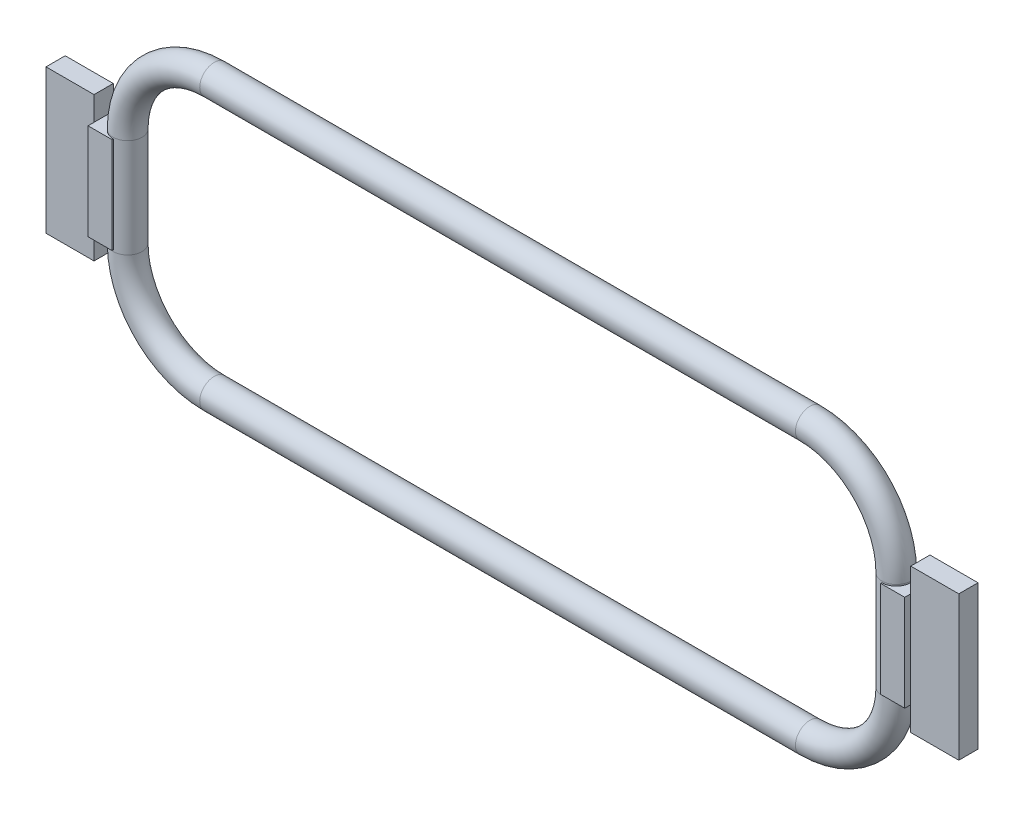
ISO-10303-21;
HEADER;
FILE_DESCRIPTION(('STEP AP214'),'2;1');
FILE_NAME('part.step','',(''),(''),'','','');
FILE_SCHEMA(('AUTOMOTIVE_DESIGN { 1 0 10303 214 1 1 1 1 }'));
ENDSEC;
DATA;
#1=APPLICATION_CONTEXT('core data for automotive mechanical design processes');
#2=APPLICATION_PROTOCOL_DEFINITION('international standard','automotive_design',2000,#1);
#3=PRODUCT_CONTEXT('',#1,'mechanical');
#4=PRODUCT('Part','Part','',(#3));
#5=PRODUCT_RELATED_PRODUCT_CATEGORY('part','',(#4));
#6=PRODUCT_DEFINITION_FORMATION('','',#4);
#7=PRODUCT_DEFINITION_CONTEXT('part definition',#1,'design');
#8=PRODUCT_DEFINITION('design','',#6,#7);
#9=PRODUCT_DEFINITION_SHAPE('','',#8);
#10=(LENGTH_UNIT() NAMED_UNIT(*) SI_UNIT(.MILLI.,.METRE.));
#11=(NAMED_UNIT(*) PLANE_ANGLE_UNIT() SI_UNIT($,.RADIAN.));
#12=(NAMED_UNIT(*) SI_UNIT($,.STERADIAN.) SOLID_ANGLE_UNIT());
#13=UNCERTAINTY_MEASURE_WITH_UNIT(LENGTH_MEASURE(1.E-05),#10,'distance_accuracy_value','');
#14=(GEOMETRIC_REPRESENTATION_CONTEXT(3) GLOBAL_UNCERTAINTY_ASSIGNED_CONTEXT((#13)) GLOBAL_UNIT_ASSIGNED_CONTEXT((#10,
#11,#12)) REPRESENTATION_CONTEXT('',''));
#15=CARTESIAN_POINT('',(0.,0.,0.));
#16=DIRECTION('',(0.,0.,1.));
#17=DIRECTION('',(1.,0.,0.));
#18=AXIS2_PLACEMENT_3D('',#15,#16,#17);
#19=CARTESIAN_POINT('',(0.,75.,-6.25));
#20=DIRECTION('',(-1.,0.,0.));
#21=DIRECTION('',(0.,-1.,0.));
#22=AXIS2_PLACEMENT_3D('',#19,#20,#21);
#23=PLANE('',#22);
#24=DIRECTION('',(0.,0.,1.));
#25=VECTOR('',#24,1.);
#26=CARTESIAN_POINT('',(0.,-50.,20.));
#27=LINE('',#26,#25);
#28=CARTESIAN_POINT('',(0.,-50.,-6.25));
#29=VERTEX_POINT('',#28);
#30=CARTESIAN_POINT('',(0.,-50.,0.));
#31=VERTEX_POINT('',#30);
#32=EDGE_CURVE('E244',#29,#31,#27,.T.);
#33=ORIENTED_EDGE('',*,*,#32,.F.);
#34=DIRECTION('',(0.,-1.,0.));
#35=VECTOR('',#34,1.);
#36=CARTESIAN_POINT('',(0.,75.,-6.25));
#37=LINE('',#36,#35);
#38=CARTESIAN_POINT('',(0.,50.,-6.25));
#39=VERTEX_POINT('',#38);
#40=EDGE_CURVE('E266',#39,#29,#37,.T.);
#41=ORIENTED_EDGE('',*,*,#40,.F.);
#42=DIRECTION('',(0.,0.,-1.));
#43=VECTOR('',#42,1.);
#44=CARTESIAN_POINT('',(0.,50.,-6.25));
#45=LINE('',#44,#43);
#46=CARTESIAN_POINT('',(0.,50.,0.));
#47=VERTEX_POINT('',#46);
#48=EDGE_CURVE('E253',#47,#39,#45,.T.);
#49=ORIENTED_EDGE('',*,*,#48,.F.);
#50=DIRECTION('',(0.,-1.,0.));
#51=VECTOR('',#50,1.);
#52=CARTESIAN_POINT('',(0.,75.,0.));
#53=LINE('',#52,#51);
#54=EDGE_CURVE('E272',#47,#31,#53,.T.);
#55=ORIENTED_EDGE('',*,*,#54,.T.);
#56=EDGE_LOOP('',(#33,#41,#49,#55));
#57=FACE_BOUND('',#56,.T.);
#58=ADVANCED_FACE('F48',(#57),#23,.F.);
#59=CARTESIAN_POINT('',(0.,0.,-6.25));
#60=DIRECTION('',(0.,0.,1.));
#61=DIRECTION('',(1.,0.,0.));
#62=AXIS2_PLACEMENT_3D('',#59,#60,#61);
#63=PLANE('',#62);
#64=DIRECTION('',(1.,0.,0.));
#65=VECTOR('',#64,1.);
#66=CARTESIAN_POINT('',(0.,-50.,-6.25));
#67=LINE('',#66,#65);
#68=CARTESIAN_POINT('',(-25.,-50.,-6.25));
#69=VERTEX_POINT('',#68);
#70=EDGE_CURVE('E234',#69,#29,#67,.T.);
#71=ORIENTED_EDGE('',*,*,#70,.F.);
#72=DIRECTION('',(0.,1.,0.));
#73=VECTOR('',#72,1.);
#74=CARTESIAN_POINT('',(-25.,-50.,-6.25));
#75=LINE('',#74,#73);
#76=CARTESIAN_POINT('',(-25.,50.,-6.25));
#77=VERTEX_POINT('',#76);
#78=EDGE_CURVE('E315',#69,#77,#75,.T.);
#79=ORIENTED_EDGE('',*,*,#78,.T.);
#80=DIRECTION('',(-1.,0.,0.));
#81=VECTOR('',#80,1.);
#82=CARTESIAN_POINT('',(-850.,49.9999999999996,-6.25));
#83=LINE('',#82,#81);
#84=EDGE_CURVE('E251',#39,#77,#83,.T.);
#85=ORIENTED_EDGE('',*,*,#84,.F.);
#86=ORIENTED_EDGE('',*,*,#40,.T.);
#87=EDGE_LOOP('',(#71,#79,#85,#86));
#88=FACE_BOUND('',#87,.T.);
#89=ADVANCED_FACE('F467',(#88),#63,.F.);
#90=CARTESIAN_POINT('',(0.,75.,26.25));
#91=DIRECTION('',(-1.,0.,0.));
#92=DIRECTION('',(0.,-1.,0.));
#93=AXIS2_PLACEMENT_3D('',#90,#91,#92);
#94=PLANE('',#93);
#95=CARTESIAN_POINT('',(0.,-50.,20.));
#96=VERTEX_POINT('',#95);
#97=CARTESIAN_POINT('',(0.,-50.,26.25));
#98=VERTEX_POINT('',#97);
#99=EDGE_CURVE('E233',#96,#98,#27,.T.);
#100=ORIENTED_EDGE('',*,*,#99,.F.);
#101=DIRECTION('',(0.,1.,0.));
#102=VECTOR('',#101,1.);
#103=CARTESIAN_POINT('',(0.,75.,20.));
#104=LINE('',#103,#102);
#105=CARTESIAN_POINT('',(0.,50.,20.));
#106=VERTEX_POINT('',#105);
#107=EDGE_CURVE('E260',#96,#106,#104,.T.);
#108=ORIENTED_EDGE('',*,*,#107,.T.);
#109=CARTESIAN_POINT('',(0.,50.,26.25));
#110=VERTEX_POINT('',#109);
#111=EDGE_CURVE('E248',#110,#106,#45,.T.);
#112=ORIENTED_EDGE('',*,*,#111,.F.);
#113=DIRECTION('',(0.,1.,0.));
#114=VECTOR('',#113,1.);
#115=CARTESIAN_POINT('',(0.,75.,26.25));
#116=LINE('',#115,#114);
#117=EDGE_CURVE('E261',#98,#110,#116,.T.);
#118=ORIENTED_EDGE('',*,*,#117,.F.);
#119=EDGE_LOOP('',(#100,#108,#112,#118));
#120=FACE_BOUND('',#119,.T.);
#121=ADVANCED_FACE('F473',(#120),#94,.F.);
#122=CARTESIAN_POINT('',(0.,0.,26.25));
#123=DIRECTION('',(0.,0.,1.));
#124=DIRECTION('',(1.,0.,0.));
#125=AXIS2_PLACEMENT_3D('',#122,#123,#124);
#126=PLANE('',#125);
#127=DIRECTION('',(0.,1.,0.));
#128=VECTOR('',#127,1.);
#129=CARTESIAN_POINT('',(-25.,-50.,26.25));
#130=LINE('',#129,#128);
#131=CARTESIAN_POINT('',(-25.,-50.,26.25));
#132=VERTEX_POINT('',#131);
#133=CARTESIAN_POINT('',(-25.,50.,26.25));
#134=VERTEX_POINT('',#133);
#135=EDGE_CURVE('E212',#132,#134,#130,.T.);
#136=ORIENTED_EDGE('',*,*,#135,.F.);
#137=DIRECTION('',(-1.,0.,0.));
#138=VECTOR('',#137,1.);
#139=CARTESIAN_POINT('',(0.,-50.,26.25));
#140=LINE('',#139,#138);
#141=EDGE_CURVE('E225',#98,#132,#140,.T.);
#142=ORIENTED_EDGE('',*,*,#141,.F.);
#143=ORIENTED_EDGE('',*,*,#117,.T.);
#144=DIRECTION('',(-1.,0.,0.));
#145=VECTOR('',#144,1.);
#146=CARTESIAN_POINT('',(0.,50.,26.25));
#147=LINE('',#146,#145);
#148=EDGE_CURVE('E228',#110,#134,#147,.T.);
#149=ORIENTED_EDGE('',*,*,#148,.T.);
#150=EDGE_LOOP('',(#136,#142,#143,#149));
#151=FACE_BOUND('',#150,.T.);
#152=ADVANCED_FACE('F224',(#151),#126,.T.);
#153=CARTESIAN_POINT('',(0.,0.,20.));
#154=DIRECTION('',(0.,0.,-1.));
#155=DIRECTION('',(-1.,0.,0.));
#156=AXIS2_PLACEMENT_3D('',#153,#154,#155);
#157=PLANE('',#156);
#158=CARTESIAN_POINT('',(0.,-75.,20.));
#159=VERTEX_POINT('',#158);
#160=EDGE_CURVE('E264',#159,#96,#104,.T.);
#161=ORIENTED_EDGE('',*,*,#160,.F.);
#162=DIRECTION('',(1.,0.,0.));
#163=VECTOR('',#162,1.);
#164=CARTESIAN_POINT('',(-50.,-75.,20.));
#165=LINE('',#164,#163);
#166=CARTESIAN_POINT('',(50.,-75.,20.));
#167=VERTEX_POINT('',#166);
#168=EDGE_CURVE('E276',#159,#167,#165,.T.);
#169=ORIENTED_EDGE('',*,*,#168,.T.);
#170=DIRECTION('',(0.,-1.,0.));
#171=VECTOR('',#170,1.);
#172=CARTESIAN_POINT('',(50.,75.,20.));
#173=LINE('',#172,#171);
#174=CARTESIAN_POINT('',(50.,75.,20.));
#175=VERTEX_POINT('',#174);
#176=EDGE_CURVE('E288',#175,#167,#173,.T.);
#177=ORIENTED_EDGE('',*,*,#176,.F.);
#178=DIRECTION('',(1.,0.,0.));
#179=VECTOR('',#178,1.);
#180=CARTESIAN_POINT('',(-50.,75.,20.));
#181=LINE('',#180,#179);
#182=CARTESIAN_POINT('',(0.,75.,20.));
#183=VERTEX_POINT('',#182);
#184=EDGE_CURVE('E282',#183,#175,#181,.T.);
#185=ORIENTED_EDGE('',*,*,#184,.F.);
#186=DIRECTION('',(0.,-1.,0.));
#187=VECTOR('',#186,1.);
#188=CARTESIAN_POINT('',(0.,0.,20.));
#189=LINE('',#188,#187);
#190=EDGE_CURVE('E256',#183,#106,#189,.T.);
#191=ORIENTED_EDGE('',*,*,#190,.T.);
#192=ORIENTED_EDGE('',*,*,#107,.F.);
#193=EDGE_LOOP('',(#161,#169,#177,#185,#191,#192));
#194=FACE_BOUND('',#193,.T.);
#195=ADVANCED_FACE('F50',(#194),#157,.F.);
#196=CARTESIAN_POINT('',(-50.,75.,20.));
#197=DIRECTION('',(0.,1.,0.));
#198=DIRECTION('',(-1.,0.,0.));
#199=AXIS2_PLACEMENT_3D('',#196,#197,#198);
#200=PLANE('',#199);
#201=DIRECTION('',(0.,0.,-1.));
#202=VECTOR('',#201,1.);
#203=CARTESIAN_POINT('',(0.,75.,-6.25));
#204=LINE('',#203,#202);
#205=CARTESIAN_POINT('',(0.,75.,0.));
#206=VERTEX_POINT('',#205);
#207=EDGE_CURVE('E245',#183,#206,#204,.T.);
#208=ORIENTED_EDGE('',*,*,#207,.F.);
#209=ORIENTED_EDGE('',*,*,#184,.T.);
#210=DIRECTION('',(0.,0.,-1.));
#211=VECTOR('',#210,1.);
#212=CARTESIAN_POINT('',(50.,75.,20.));
#213=LINE('',#212,#211);
#214=CARTESIAN_POINT('',(50.,75.,0.));
#215=VERTEX_POINT('',#214);
#216=EDGE_CURVE('E273',#175,#215,#213,.T.);
#217=ORIENTED_EDGE('',*,*,#216,.T.);
#218=DIRECTION('',(1.,0.,0.));
#219=VECTOR('',#218,1.);
#220=CARTESIAN_POINT('',(-50.,75.,0.));
#221=LINE('',#220,#219);
#222=EDGE_CURVE('E285',#206,#215,#221,.T.);
#223=ORIENTED_EDGE('',*,*,#222,.F.);
#224=EDGE_LOOP('',(#208,#209,#217,#223));
#225=FACE_BOUND('',#224,.T.);
#226=ADVANCED_FACE('F479',(#225),#200,.T.);
#227=CARTESIAN_POINT('',(-50.,-75.,20.));
#228=DIRECTION('',(0.,1.,0.));
#229=DIRECTION('',(-1.,0.,0.));
#230=AXIS2_PLACEMENT_3D('',#227,#228,#229);
#231=PLANE('',#230);
#232=ORIENTED_EDGE('',*,*,#168,.F.);
#233=DIRECTION('',(0.,0.,1.));
#234=VECTOR('',#233,1.);
#235=CARTESIAN_POINT('',(0.,-75.,20.));
#236=LINE('',#235,#234);
#237=CARTESIAN_POINT('',(0.,-75.,0.));
#238=VERTEX_POINT('',#237);
#239=EDGE_CURVE('E235',#238,#159,#236,.T.);
#240=ORIENTED_EDGE('',*,*,#239,.F.);
#241=DIRECTION('',(1.,0.,0.));
#242=VECTOR('',#241,1.);
#243=CARTESIAN_POINT('',(-50.,-75.,0.));
#244=LINE('',#243,#242);
#245=CARTESIAN_POINT('',(50.,-75.,0.));
#246=VERTEX_POINT('',#245);
#247=EDGE_CURVE('E279',#238,#246,#244,.T.);
#248=ORIENTED_EDGE('',*,*,#247,.T.);
#249=DIRECTION('',(0.,0.,-1.));
#250=VECTOR('',#249,1.);
#251=CARTESIAN_POINT('',(50.,-75.,20.));
#252=LINE('',#251,#250);
#253=EDGE_CURVE('E269',#167,#246,#252,.T.);
#254=ORIENTED_EDGE('',*,*,#253,.F.);
#255=EDGE_LOOP('',(#232,#240,#248,#254));
#256=FACE_BOUND('',#255,.T.);
#257=ADVANCED_FACE('F482',(#256),#231,.F.);
#258=CARTESIAN_POINT('',(50.,75.,20.));
#259=DIRECTION('',(1.,0.,0.));
#260=DIRECTION('',(0.,1.,0.));
#261=AXIS2_PLACEMENT_3D('',#258,#259,#260);
#262=PLANE('',#261);
#263=DIRECTION('',(0.,-1.,0.));
#264=VECTOR('',#263,1.);
#265=CARTESIAN_POINT('',(50.,75.,0.));
#266=LINE('',#265,#264);
#267=EDGE_CURVE('E281',#215,#246,#266,.T.);
#268=ORIENTED_EDGE('',*,*,#267,.F.);
#269=ORIENTED_EDGE('',*,*,#216,.F.);
#270=ORIENTED_EDGE('',*,*,#176,.T.);
#271=ORIENTED_EDGE('',*,*,#253,.T.);
#272=EDGE_LOOP('',(#268,#269,#270,#271));
#273=FACE_BOUND('',#272,.T.);
#274=ADVANCED_FACE('F484',(#273),#262,.T.);
#275=CARTESIAN_POINT('',(0.,0.,0.));
#276=DIRECTION('',(0.,0.,-1.));
#277=DIRECTION('',(-1.,0.,0.));
#278=AXIS2_PLACEMENT_3D('',#275,#276,#277);
#279=PLANE('',#278);
#280=EDGE_CURVE('E270',#206,#47,#53,.T.);
#281=ORIENTED_EDGE('',*,*,#280,.F.);
#282=ORIENTED_EDGE('',*,*,#222,.T.);
#283=ORIENTED_EDGE('',*,*,#267,.T.);
#284=ORIENTED_EDGE('',*,*,#247,.F.);
#285=EDGE_CURVE('E263',#31,#238,#53,.T.);
#286=ORIENTED_EDGE('',*,*,#285,.F.);
#287=ORIENTED_EDGE('',*,*,#54,.F.);
#288=EDGE_LOOP('',(#281,#282,#283,#284,#286,#287));
#289=FACE_BOUND('',#288,.T.);
#290=ADVANCED_FACE('F487',(#289),#279,.T.);
#291=CARTESIAN_POINT('',(0.,50.,-6.25));
#292=DIRECTION('',(1.,0.,0.));
#293=DIRECTION('',(0.,1.,0.));
#294=AXIS2_PLACEMENT_3D('',#291,#292,#293);
#295=PLANE('',#294);
#296=ORIENTED_EDGE('',*,*,#207,.T.);
#297=ORIENTED_EDGE('',*,*,#280,.T.);
#298=EDGE_CURVE('E252',#106,#47,#45,.T.);
#299=ORIENTED_EDGE('',*,*,#298,.F.);
#300=ORIENTED_EDGE('',*,*,#190,.F.);
#301=EDGE_LOOP('',(#296,#297,#299,#300));
#302=FACE_BOUND('',#301,.T.);
#303=ADVANCED_FACE('F492',(#302),#295,.F.);
#304=CARTESIAN_POINT('',(0.,50.,0.));
#305=DIRECTION('',(0.,1.,0.));
#306=DIRECTION('',(-1.,0.,0.));
#307=AXIS2_PLACEMENT_3D('',#304,#305,#306);
#308=PLANE('',#307);
#309=DIRECTION('',(0.,0.,-1.));
#310=VECTOR('',#309,1.);
#311=CARTESIAN_POINT('',(-25.,50.,-5.00000000000014));
#312=LINE('',#311,#310);
#313=CARTESIAN_POINT('',(-25.,50.,-5.00000000000014));
#314=VERTEX_POINT('',#313);
#315=EDGE_CURVE('E219',#314,#77,#312,.T.);
#316=ORIENTED_EDGE('',*,*,#315,.F.);
#317=CARTESIAN_POINT('',(-25.0000000000004,50.,10.));
#318=DIRECTION('',(0.,1.,0.));
#319=DIRECTION('',(-1.,0.,0.));
#320=AXIS2_PLACEMENT_3D('',#317,#318,#319);
#321=CIRCLE('',#320,15.);
#322=CARTESIAN_POINT('',(-25.,50.,25.0000000000001));
#323=VERTEX_POINT('',#322);
#324=EDGE_CURVE('E241',#323,#314,#321,.T.);
#325=ORIENTED_EDGE('',*,*,#324,.F.);
#326=DIRECTION('',(0.,0.,-1.));
#327=VECTOR('',#326,1.);
#328=CARTESIAN_POINT('',(-25.,50.,26.25));
#329=LINE('',#328,#327);
#330=EDGE_CURVE('E307',#134,#323,#329,.T.);
#331=ORIENTED_EDGE('',*,*,#330,.F.);
#332=ORIENTED_EDGE('',*,*,#148,.F.);
#333=ORIENTED_EDGE('',*,*,#111,.T.);
#334=ORIENTED_EDGE('',*,*,#298,.T.);
#335=ORIENTED_EDGE('',*,*,#48,.T.);
#336=ORIENTED_EDGE('',*,*,#84,.T.);
#337=EDGE_LOOP('',(#316,#325,#331,#332,#333,#334,#335,#336));
#338=FACE_BOUND('',#337,.T.);
#339=ADVANCED_FACE('F306',(#338),#308,.T.);
#340=CARTESIAN_POINT('',(0.,-50.,0.));
#341=DIRECTION('',(0.,-1.,0.));
#342=DIRECTION('',(1.,0.,0.));
#343=AXIS2_PLACEMENT_3D('',#340,#341,#342);
#344=PLANE('',#343);
#345=DIRECTION('',(0.,0.,-1.));
#346=VECTOR('',#345,1.);
#347=CARTESIAN_POINT('',(-25.,-50.,-5.00000000000014));
#348=LINE('',#347,#346);
#349=CARTESIAN_POINT('',(-25.0000000000004,-50.,-5.00000000000001));
#350=VERTEX_POINT('',#349);
#351=EDGE_CURVE('E63',#350,#69,#348,.T.);
#352=ORIENTED_EDGE('',*,*,#351,.T.);
#353=ORIENTED_EDGE('',*,*,#70,.T.);
#354=ORIENTED_EDGE('',*,*,#32,.T.);
#355=EDGE_CURVE('E246',#31,#96,#27,.T.);
#356=ORIENTED_EDGE('',*,*,#355,.T.);
#357=ORIENTED_EDGE('',*,*,#99,.T.);
#358=ORIENTED_EDGE('',*,*,#141,.T.);
#359=DIRECTION('',(0.,0.,-1.));
#360=VECTOR('',#359,1.);
#361=CARTESIAN_POINT('',(-25.,-50.,26.25));
#362=LINE('',#361,#360);
#363=CARTESIAN_POINT('',(-25.,-50.,25.0000000000001));
#364=VERTEX_POINT('',#363);
#365=EDGE_CURVE('E208',#132,#364,#362,.T.);
#366=ORIENTED_EDGE('',*,*,#365,.T.);
#367=CARTESIAN_POINT('',(-25.0000000000004,-50.,10.));
#368=DIRECTION('',(0.,-1.,0.));
#369=DIRECTION('',(1.,0.,0.));
#370=AXIS2_PLACEMENT_3D('',#367,#368,#369);
#371=CIRCLE('',#370,15.);
#372=EDGE_CURVE('E293',#350,#364,#371,.T.);
#373=ORIENTED_EDGE('',*,*,#372,.F.);
#374=EDGE_LOOP('',(#352,#353,#354,#356,#357,#358,#366,#373));
#375=FACE_BOUND('',#374,.T.);
#376=ADVANCED_FACE('F230',(#375),#344,.T.);
#377=CARTESIAN_POINT('',(0.,-50.,20.));
#378=DIRECTION('',(1.,0.,0.));
#379=DIRECTION('',(0.,1.,0.));
#380=AXIS2_PLACEMENT_3D('',#377,#378,#379);
#381=PLANE('',#380);
#382=ORIENTED_EDGE('',*,*,#355,.F.);
#383=ORIENTED_EDGE('',*,*,#285,.T.);
#384=ORIENTED_EDGE('',*,*,#239,.T.);
#385=ORIENTED_EDGE('',*,*,#160,.T.);
#386=EDGE_LOOP('',(#382,#383,#384,#385));
#387=FACE_BOUND('',#386,.T.);
#388=ADVANCED_FACE('F432',(#387),#381,.F.);
#389=CARTESIAN_POINT('',(-25.0000000000004,-51.5048770420163,10.));
#390=DIRECTION('',(0.,1.,0.));
#391=DIRECTION('',(0.,0.,1.));
#392=AXIS2_PLACEMENT_3D('',#389,#390,#391);
#393=CYLINDRICAL_SURFACE('',#392,15.);
#394=ORIENTED_EDGE('',*,*,#324,.T.);
#395=DIRECTION('',(0.,1.,0.));
#396=VECTOR('',#395,1.);
#397=CARTESIAN_POINT('',(-25.,-50.,-5.00000000000014));
#398=LINE('',#397,#396);
#399=EDGE_CURVE('E303',#350,#314,#398,.T.);
#400=ORIENTED_EDGE('',*,*,#399,.F.);
#401=ORIENTED_EDGE('',*,*,#372,.T.);
#402=DIRECTION('',(0.,1.,0.));
#403=VECTOR('',#402,1.);
#404=CARTESIAN_POINT('',(-25.,-50.,25.0000000000001));
#405=LINE('',#404,#403);
#406=EDGE_CURVE('E214',#364,#323,#405,.T.);
#407=ORIENTED_EDGE('',*,*,#406,.T.);
#408=EDGE_LOOP('',(#394,#400,#401,#407));
#409=FACE_BOUND('',#408,.T.);
#410=CARTESIAN_POINT('',(-25.0000000000004,51.5048770420157,10.));
#411=DIRECTION('',(0.,1.,0.));
#412=DIRECTION('',(-1.,0.,0.));
#413=AXIS2_PLACEMENT_3D('',#410,#411,#412);
#414=CIRCLE('',#413,15.);
#415=CARTESIAN_POINT('',(-10.0000000000004,51.5048770420156,10.));
#416=VERTEX_POINT('',#415);
#417=EDGE_CURVE('E408',#416,#416,#414,.T.);
#418=ORIENTED_EDGE('',*,*,#417,.F.);
#419=EDGE_LOOP('',(#418));
#420=FACE_BOUND('',#419,.T.);
#421=CARTESIAN_POINT('',(-25.0000000000004,-51.5048770420163,10.));
#422=DIRECTION('',(0.,1.,0.));
#423=DIRECTION('',(-1.,0.,0.));
#424=AXIS2_PLACEMENT_3D('',#421,#422,#423);
#425=CIRCLE('',#424,15.);
#426=CARTESIAN_POINT('',(-10.0000000000004,-51.5048770420163,10.));
#427=VERTEX_POINT('',#426);
#428=EDGE_CURVE('E405',#427,#427,#425,.T.);
#429=ORIENTED_EDGE('',*,*,#428,.T.);
#430=EDGE_LOOP('',(#429));
#431=FACE_BOUND('',#430,.T.);
#432=ADVANCED_FACE('F301',(#409,#420,#431),#393,.T.);
#433=CARTESIAN_POINT('',(-735.,51.5048770420163,10.));
#434=DIRECTION('',(0.,0.,1.));
#435=DIRECTION('',(1.,0.,0.));
#436=AXIS2_PLACEMENT_3D('',#433,#434,#435);
#437=TOROIDAL_SURFACE('',#436,90.,15.);
#438=CARTESIAN_POINT('',(-734.999999999999,141.504877042016,10.));
#439=DIRECTION('',(-1.,0.,0.));
#440=DIRECTION('',(0.,-1.,0.));
#441=AXIS2_PLACEMENT_3D('',#438,#439,#440);
#442=CIRCLE('',#441,15.);
#443=CARTESIAN_POINT('',(-734.999999999999,156.504877042016,10.));
#444=VERTEX_POINT('',#443);
#445=EDGE_CURVE('E238',#444,#444,#442,.T.);
#446=CARTESIAN_POINT('',(-825.,51.5048770420157,10.));
#447=DIRECTION('',(0.,-1.,0.));
#448=DIRECTION('',(1.,0.,0.));
#449=AXIS2_PLACEMENT_3D('',#446,#447,#448);
#450=CIRCLE('',#449,15.);
#451=CARTESIAN_POINT('',(-840.,51.5048770420156,10.));
#452=VERTEX_POINT('',#451);
#453=EDGE_CURVE('E393',#452,#452,#450,.T.);
#454=CARTESIAN_POINT('',(-735.,51.5048770420163,10.));
#455=DIRECTION('',(0.,0.,1.));
#456=DIRECTION('',(1.,0.,0.));
#457=AXIS2_PLACEMENT_3D('',#454,#455,#456);
#458=CIRCLE('',#457,105.);
#459=EDGE_CURVE('',#444,#452,#458,.T.);
#460=ORIENTED_EDGE('',*,*,#445,.T.);
#461=ORIENTED_EDGE('',*,*,#453,.F.);
#462=ORIENTED_EDGE('',*,*,#459,.T.);
#463=ORIENTED_EDGE('',*,*,#459,.F.);
#464=EDGE_LOOP('',(#460,#462,#461,#463));
#465=FACE_BOUND('',#464,.T.);
#466=ADVANCED_FACE('F416',(#465),#437,.T.);
#467=CARTESIAN_POINT('',(-115.000000000001,141.504877042016,10.));
#468=DIRECTION('',(-1.,0.,0.));
#469=DIRECTION('',(0.,0.,1.));
#470=AXIS2_PLACEMENT_3D('',#467,#468,#469);
#471=CYLINDRICAL_SURFACE('',#470,15.);
#472=ORIENTED_EDGE('',*,*,#445,.F.);
#473=EDGE_LOOP('',(#472));
#474=FACE_BOUND('',#473,.T.);
#475=CARTESIAN_POINT('',(-115.000000000001,141.504877042016,10.));
#476=DIRECTION('',(-1.,0.,0.));
#477=DIRECTION('',(0.,-1.,0.));
#478=AXIS2_PLACEMENT_3D('',#475,#476,#477);
#479=CIRCLE('',#478,15.);
#480=CARTESIAN_POINT('',(-115.000000000001,156.504877042016,10.));
#481=VERTEX_POINT('',#480);
#482=EDGE_CURVE('E411',#481,#481,#479,.T.);
#483=ORIENTED_EDGE('',*,*,#482,.T.);
#484=EDGE_LOOP('',(#483));
#485=FACE_BOUND('',#484,.T.);
#486=ADVANCED_FACE('F418',(#474,#485),#471,.T.);
#487=CARTESIAN_POINT('',(-115.,51.5048770420163,10.));
#488=DIRECTION('',(0.,0.,1.));
#489=DIRECTION('',(1.,0.,0.));
#490=AXIS2_PLACEMENT_3D('',#487,#488,#489);
#491=TOROIDAL_SURFACE('',#490,90.,15.);
#492=CARTESIAN_POINT('',(-115.,51.5048770420163,10.));
#493=DIRECTION('',(0.,0.,1.));
#494=DIRECTION('',(1.,0.,0.));
#495=AXIS2_PLACEMENT_3D('',#492,#493,#494);
#496=CIRCLE('',#495,105.);
#497=EDGE_CURVE('',#416,#481,#496,.T.);
#498=ORIENTED_EDGE('',*,*,#417,.T.);
#499=ORIENTED_EDGE('',*,*,#482,.F.);
#500=ORIENTED_EDGE('',*,*,#497,.T.);
#501=ORIENTED_EDGE('',*,*,#497,.F.);
#502=EDGE_LOOP('',(#498,#500,#499,#501));
#503=FACE_BOUND('',#502,.T.);
#504=ADVANCED_FACE('F421',(#503),#491,.T.);
#505=CARTESIAN_POINT('',(-115.,-51.5048770420163,10.));
#506=DIRECTION('',(0.,0.,1.));
#507=DIRECTION('',(1.,0.,0.));
#508=AXIS2_PLACEMENT_3D('',#505,#506,#507);
#509=TOROIDAL_SURFACE('',#508,90.,15.);
#510=CARTESIAN_POINT('',(-115.000000000001,-141.504877042016,10.));
#511=DIRECTION('',(1.,0.,0.));
#512=DIRECTION('',(0.,1.,0.));
#513=AXIS2_PLACEMENT_3D('',#510,#511,#512);
#514=CIRCLE('',#513,15.);
#515=CARTESIAN_POINT('',(-115.000000000001,-156.504877042016,10.));
#516=VERTEX_POINT('',#515);
#517=EDGE_CURVE('E402',#516,#516,#514,.T.);
#518=CARTESIAN_POINT('',(-115.,-51.5048770420163,10.));
#519=DIRECTION('',(0.,0.,1.));
#520=DIRECTION('',(1.,0.,0.));
#521=AXIS2_PLACEMENT_3D('',#518,#519,#520);
#522=CIRCLE('',#521,105.);
#523=EDGE_CURVE('',#516,#427,#522,.T.);
#524=ORIENTED_EDGE('',*,*,#517,.T.);
#525=ORIENTED_EDGE('',*,*,#428,.F.);
#526=ORIENTED_EDGE('',*,*,#523,.T.);
#527=ORIENTED_EDGE('',*,*,#523,.F.);
#528=EDGE_LOOP('',(#524,#526,#525,#527));
#529=FACE_BOUND('',#528,.T.);
#530=ADVANCED_FACE('F427',(#529),#509,.T.);
#531=CARTESIAN_POINT('',(-734.999999999999,-141.504877042016,10.));
#532=DIRECTION('',(1.,0.,0.));
#533=DIRECTION('',(0.,0.,-1.));
#534=AXIS2_PLACEMENT_3D('',#531,#532,#533);
#535=CYLINDRICAL_SURFACE('',#534,15.);
#536=ORIENTED_EDGE('',*,*,#517,.F.);
#537=EDGE_LOOP('',(#536));
#538=FACE_BOUND('',#537,.T.);
#539=CARTESIAN_POINT('',(-734.999999999999,-141.504877042016,10.));
#540=DIRECTION('',(1.,0.,0.));
#541=DIRECTION('',(0.,1.,0.));
#542=AXIS2_PLACEMENT_3D('',#539,#540,#541);
#543=CIRCLE('',#542,15.);
#544=CARTESIAN_POINT('',(-734.999999999999,-156.504877042017,10.));
#545=VERTEX_POINT('',#544);
#546=EDGE_CURVE('E399',#545,#545,#543,.T.);
#547=ORIENTED_EDGE('',*,*,#546,.T.);
#548=EDGE_LOOP('',(#547));
#549=FACE_BOUND('',#548,.T.);
#550=ADVANCED_FACE('F438',(#538,#549),#535,.T.);
#551=CARTESIAN_POINT('',(-735.,-51.5048770420163,10.));
#552=DIRECTION('',(0.,0.,1.));
#553=DIRECTION('',(1.,0.,0.));
#554=AXIS2_PLACEMENT_3D('',#551,#552,#553);
#555=TOROIDAL_SURFACE('',#554,90.0000000000003,15.);
#556=CARTESIAN_POINT('',(-825.,-51.5048770420157,10.));
#557=DIRECTION('',(0.,-1.,0.));
#558=DIRECTION('',(1.,0.,0.));
#559=AXIS2_PLACEMENT_3D('',#556,#557,#558);
#560=CIRCLE('',#559,15.);
#561=CARTESIAN_POINT('',(-840.,-51.5048770420156,10.));
#562=VERTEX_POINT('',#561);
#563=EDGE_CURVE('E396',#562,#562,#560,.T.);
#564=CARTESIAN_POINT('',(-735.,-51.5048770420163,10.));
#565=DIRECTION('',(0.,0.,1.));
#566=DIRECTION('',(1.,0.,0.));
#567=AXIS2_PLACEMENT_3D('',#564,#565,#566);
#568=CIRCLE('',#567,105.);
#569=EDGE_CURVE('',#562,#545,#568,.T.);
#570=ORIENTED_EDGE('',*,*,#563,.T.);
#571=ORIENTED_EDGE('',*,*,#546,.F.);
#572=ORIENTED_EDGE('',*,*,#569,.T.);
#573=ORIENTED_EDGE('',*,*,#569,.F.);
#574=EDGE_LOOP('',(#570,#572,#571,#573));
#575=FACE_BOUND('',#574,.T.);
#576=ADVANCED_FACE('F444',(#575),#555,.T.);
#577=CARTESIAN_POINT('',(-825.,51.5048770420157,10.));
#578=DIRECTION('',(0.,-1.,0.));
#579=DIRECTION('',(0.,0.,-1.));
#580=AXIS2_PLACEMENT_3D('',#577,#578,#579);
#581=CYLINDRICAL_SURFACE('',#580,15.);
#582=CARTESIAN_POINT('',(-825.,-50.0000000000001,10.));
#583=DIRECTION('',(0.,-1.,0.));
#584=DIRECTION('',(1.,0.,0.));
#585=AXIS2_PLACEMENT_3D('',#582,#583,#584);
#586=CIRCLE('',#585,15.);
#587=CARTESIAN_POINT('',(-825.,-50.0000000000001,-5.00000000000001));
#588=VERTEX_POINT('',#587);
#589=CARTESIAN_POINT('',(-825.,-50.,25.0000000000001));
#590=VERTEX_POINT('',#589);
#591=EDGE_CURVE('E56',#588,#590,#586,.F.);
#592=ORIENTED_EDGE('',*,*,#591,.F.);
#593=DIRECTION('',(0.,1.,0.));
#594=VECTOR('',#593,1.);
#595=CARTESIAN_POINT('',(-825.,-50.,-5.00000000000014));
#596=LINE('',#595,#594);
#597=CARTESIAN_POINT('',(-825.,50.,-5.00000000000014));
#598=VERTEX_POINT('',#597);
#599=EDGE_CURVE('E71',#588,#598,#596,.T.);
#600=ORIENTED_EDGE('',*,*,#599,.T.);
#601=CARTESIAN_POINT('',(-825.,49.9999999999996,10.));
#602=DIRECTION('',(0.,1.,0.));
#603=DIRECTION('',(-1.,0.,0.));
#604=AXIS2_PLACEMENT_3D('',#601,#602,#603);
#605=CIRCLE('',#604,15.);
#606=CARTESIAN_POINT('',(-825.,50.,25.0000000000001));
#607=VERTEX_POINT('',#606);
#608=EDGE_CURVE('E12',#607,#598,#605,.F.);
#609=ORIENTED_EDGE('',*,*,#608,.F.);
#610=DIRECTION('',(0.,1.,0.));
#611=VECTOR('',#610,1.);
#612=CARTESIAN_POINT('',(-825.,-50.,25.0000000000001));
#613=LINE('',#612,#611);
#614=EDGE_CURVE('E331',#590,#607,#613,.T.);
#615=ORIENTED_EDGE('',*,*,#614,.F.);
#616=EDGE_LOOP('',(#592,#600,#609,#615));
#617=FACE_BOUND('',#616,.T.);
#618=ORIENTED_EDGE('',*,*,#563,.F.);
#619=EDGE_LOOP('',(#618));
#620=FACE_BOUND('',#619,.T.);
#621=ORIENTED_EDGE('',*,*,#453,.T.);
#622=EDGE_LOOP('',(#621));
#623=FACE_BOUND('',#622,.T.);
#624=ADVANCED_FACE('F450',(#617,#620,#623),#581,.T.);
#625=CARTESIAN_POINT('',(-850.,74.9999999999999,-6.25));
#626=DIRECTION('',(1.,0.,0.));
#627=DIRECTION('',(0.,0.,-1.));
#628=AXIS2_PLACEMENT_3D('',#625,#626,#627);
#629=PLANE('',#628);
#630=DIRECTION('',(0.,0.,-1.));
#631=VECTOR('',#630,1.);
#632=CARTESIAN_POINT('',(-850.,-50.0000000000001,20.));
#633=LINE('',#632,#631);
#634=CARTESIAN_POINT('',(-850.,-50.0000000000001,0.));
#635=VERTEX_POINT('',#634);
#636=CARTESIAN_POINT('',(-850.,-50.0000000000001,-6.25));
#637=VERTEX_POINT('',#636);
#638=EDGE_CURVE('E337',#635,#637,#633,.T.);
#639=ORIENTED_EDGE('',*,*,#638,.F.);
#640=DIRECTION('',(0.,1.,0.));
#641=VECTOR('',#640,1.);
#642=CARTESIAN_POINT('',(-850.,74.9999999999999,0.));
#643=LINE('',#642,#641);
#644=CARTESIAN_POINT('',(-850.,49.9999999999996,0.));
#645=VERTEX_POINT('',#644);
#646=EDGE_CURVE('E364',#635,#645,#643,.T.);
#647=ORIENTED_EDGE('',*,*,#646,.T.);
#648=DIRECTION('',(0.,0.,1.));
#649=VECTOR('',#648,1.);
#650=CARTESIAN_POINT('',(-850.,49.9999999999996,-6.25));
#651=LINE('',#650,#649);
#652=CARTESIAN_POINT('',(-850.,49.9999999999996,-6.25));
#653=VERTEX_POINT('',#652);
#654=EDGE_CURVE('E346',#653,#645,#651,.T.);
#655=ORIENTED_EDGE('',*,*,#654,.F.);
#656=DIRECTION('',(0.,1.,0.));
#657=VECTOR('',#656,1.);
#658=CARTESIAN_POINT('',(-850.,74.9999999999999,-6.25));
#659=LINE('',#658,#657);
#660=EDGE_CURVE('E368',#637,#653,#659,.T.);
#661=ORIENTED_EDGE('',*,*,#660,.F.);
#662=EDGE_LOOP('',(#639,#647,#655,#661));
#663=FACE_BOUND('',#662,.T.);
#664=ADVANCED_FACE('F456',(#663),#629,.F.);
#665=CARTESIAN_POINT('',(0.,0.,-6.25));
#666=DIRECTION('',(0.,0.,-1.));
#667=DIRECTION('',(-1.,0.,0.));
#668=AXIS2_PLACEMENT_3D('',#665,#666,#667);
#669=PLANE('',#668);
#670=DIRECTION('',(0.,1.,0.));
#671=VECTOR('',#670,1.);
#672=CARTESIAN_POINT('',(-825.,-50.,-6.25));
#673=LINE('',#672,#671);
#674=CARTESIAN_POINT('',(-825.,-50.,-6.25));
#675=VERTEX_POINT('',#674);
#676=CARTESIAN_POINT('',(-825.,50.,-6.25));
#677=VERTEX_POINT('',#676);
#678=EDGE_CURVE('E325',#675,#677,#673,.T.);
#679=ORIENTED_EDGE('',*,*,#678,.F.);
#680=DIRECTION('',(1.,0.,0.));
#681=VECTOR('',#680,1.);
#682=CARTESIAN_POINT('',(0.,-50.,-6.25));
#683=LINE('',#682,#681);
#684=EDGE_CURVE('E340',#637,#675,#683,.T.);
#685=ORIENTED_EDGE('',*,*,#684,.F.);
#686=ORIENTED_EDGE('',*,*,#660,.T.);
#687=DIRECTION('',(-1.,0.,0.));
#688=VECTOR('',#687,1.);
#689=CARTESIAN_POINT('',(-850.,49.9999999999996,-6.25));
#690=LINE('',#689,#688);
#691=EDGE_CURVE('E354',#677,#653,#690,.T.);
#692=ORIENTED_EDGE('',*,*,#691,.F.);
#693=EDGE_LOOP('',(#679,#685,#686,#692));
#694=FACE_BOUND('',#693,.T.);
#695=ADVANCED_FACE('F564',(#694),#669,.T.);
#696=CARTESIAN_POINT('',(-850.,74.9999999999999,26.25));
#697=DIRECTION('',(1.,0.,0.));
#698=DIRECTION('',(0.,0.,-1.));
#699=AXIS2_PLACEMENT_3D('',#696,#697,#698);
#700=PLANE('',#699);
#701=CARTESIAN_POINT('',(-850.,-50.0000000000001,26.25));
#702=VERTEX_POINT('',#701);
#703=CARTESIAN_POINT('',(-850.,-50.0000000000001,20.));
#704=VERTEX_POINT('',#703);
#705=EDGE_CURVE('E338',#702,#704,#633,.T.);
#706=ORIENTED_EDGE('',*,*,#705,.F.);
#707=DIRECTION('',(0.,-1.,0.));
#708=VECTOR('',#707,1.);
#709=CARTESIAN_POINT('',(-850.,74.9999999999999,26.25));
#710=LINE('',#709,#708);
#711=CARTESIAN_POINT('',(-850.,49.9999999999996,26.25));
#712=VERTEX_POINT('',#711);
#713=EDGE_CURVE('E361',#712,#702,#710,.T.);
#714=ORIENTED_EDGE('',*,*,#713,.F.);
#715=CARTESIAN_POINT('',(-850.,49.9999999999996,20.));
#716=VERTEX_POINT('',#715);
#717=EDGE_CURVE('E351',#716,#712,#651,.T.);
#718=ORIENTED_EDGE('',*,*,#717,.F.);
#719=DIRECTION('',(0.,-1.,0.));
#720=VECTOR('',#719,1.);
#721=CARTESIAN_POINT('',(-850.,74.9999999999999,20.));
#722=LINE('',#721,#720);
#723=EDGE_CURVE('E367',#716,#704,#722,.T.);
#724=ORIENTED_EDGE('',*,*,#723,.T.);
#725=EDGE_LOOP('',(#706,#714,#718,#724));
#726=FACE_BOUND('',#725,.T.);
#727=ADVANCED_FACE('F560',(#726),#700,.F.);
#728=CARTESIAN_POINT('',(0.,0.,26.25));
#729=DIRECTION('',(0.,0.,-1.));
#730=DIRECTION('',(-1.,0.,0.));
#731=AXIS2_PLACEMENT_3D('',#728,#729,#730);
#732=PLANE('',#731);
#733=DIRECTION('',(-1.,0.,0.));
#734=VECTOR('',#733,1.);
#735=CARTESIAN_POINT('',(0.,-50.,26.25));
#736=LINE('',#735,#734);
#737=CARTESIAN_POINT('',(-825.,-50.,26.25));
#738=VERTEX_POINT('',#737);
#739=EDGE_CURVE('E335',#738,#702,#736,.T.);
#740=ORIENTED_EDGE('',*,*,#739,.F.);
#741=DIRECTION('',(0.,1.,0.));
#742=VECTOR('',#741,1.);
#743=CARTESIAN_POINT('',(-825.,-50.,26.25));
#744=LINE('',#743,#742);
#745=CARTESIAN_POINT('',(-825.,50.,26.25));
#746=VERTEX_POINT('',#745);
#747=EDGE_CURVE('E311',#738,#746,#744,.T.);
#748=ORIENTED_EDGE('',*,*,#747,.T.);
#749=DIRECTION('',(1.,0.,0.));
#750=VECTOR('',#749,1.);
#751=CARTESIAN_POINT('',(-850.,49.9999999999996,26.25));
#752=LINE('',#751,#750);
#753=EDGE_CURVE('E349',#712,#746,#752,.T.);
#754=ORIENTED_EDGE('',*,*,#753,.F.);
#755=ORIENTED_EDGE('',*,*,#713,.T.);
#756=EDGE_LOOP('',(#740,#748,#754,#755));
#757=FACE_BOUND('',#756,.T.);
#758=ADVANCED_FACE('F556',(#757),#732,.F.);
#759=CARTESIAN_POINT('',(0.,0.,0.));
#760=DIRECTION('',(0.,0.,1.));
#761=DIRECTION('',(1.,0.,0.));
#762=AXIS2_PLACEMENT_3D('',#759,#760,#761);
#763=PLANE('',#762);
#764=CARTESIAN_POINT('',(-850.,-75.0000000000001,0.));
#765=VERTEX_POINT('',#764);
#766=EDGE_CURVE('E372',#765,#635,#643,.T.);
#767=ORIENTED_EDGE('',*,*,#766,.F.);
#768=DIRECTION('',(-1.,0.,0.));
#769=VECTOR('',#768,1.);
#770=CARTESIAN_POINT('',(0.,-75.,0.));
#771=LINE('',#770,#769);
#772=CARTESIAN_POINT('',(-900.,-75.0000000000001,0.));
#773=VERTEX_POINT('',#772);
#774=EDGE_CURVE('E377',#765,#773,#771,.T.);
#775=ORIENTED_EDGE('',*,*,#774,.T.);
#776=DIRECTION('',(0.,-1.,0.));
#777=VECTOR('',#776,1.);
#778=CARTESIAN_POINT('',(-900.,0.,0.));
#779=LINE('',#778,#777);
#780=CARTESIAN_POINT('',(-900.,74.9999999999999,0.));
#781=VERTEX_POINT('',#780);
#782=EDGE_CURVE('E384',#781,#773,#779,.T.);
#783=ORIENTED_EDGE('',*,*,#782,.F.);
#784=DIRECTION('',(-1.,0.,0.));
#785=VECTOR('',#784,1.);
#786=CARTESIAN_POINT('',(0.,74.9999999999998,0.));
#787=LINE('',#786,#785);
#788=CARTESIAN_POINT('',(-850.,74.9999999999996,0.));
#789=VERTEX_POINT('',#788);
#790=EDGE_CURVE('E371',#789,#781,#787,.T.);
#791=ORIENTED_EDGE('',*,*,#790,.F.);
#792=DIRECTION('',(0.,-1.,0.));
#793=VECTOR('',#792,1.);
#794=CARTESIAN_POINT('',(-850.,-3.53883589099269E-13,0.));
#795=LINE('',#794,#793);
#796=EDGE_CURVE('E356',#789,#645,#795,.T.);
#797=ORIENTED_EDGE('',*,*,#796,.T.);
#798=ORIENTED_EDGE('',*,*,#646,.F.);
#799=EDGE_LOOP('',(#767,#775,#783,#791,#797,#798));
#800=FACE_BOUND('',#799,.T.);
#801=ADVANCED_FACE('F559',(#800),#763,.F.);
#802=CARTESIAN_POINT('',(0.,74.9999999999998,20.));
#803=DIRECTION('',(0.,-1.,0.));
#804=DIRECTION('',(1.,0.,0.));
#805=AXIS2_PLACEMENT_3D('',#802,#803,#804);
#806=PLANE('',#805);
#807=DIRECTION('',(-1.,0.,0.));
#808=VECTOR('',#807,1.);
#809=CARTESIAN_POINT('',(0.,74.9999999999998,20.));
#810=LINE('',#809,#808);
#811=CARTESIAN_POINT('',(-850.,74.9999999999996,20.));
#812=VERTEX_POINT('',#811);
#813=CARTESIAN_POINT('',(-900.,74.9999999999999,20.));
#814=VERTEX_POINT('',#813);
#815=EDGE_CURVE('E374',#812,#814,#810,.T.);
#816=ORIENTED_EDGE('',*,*,#815,.F.);
#817=DIRECTION('',(0.,0.,1.));
#818=VECTOR('',#817,1.);
#819=CARTESIAN_POINT('',(-850.,74.9999999999996,-6.25));
#820=LINE('',#819,#818);
#821=EDGE_CURVE('E344',#789,#812,#820,.T.);
#822=ORIENTED_EDGE('',*,*,#821,.F.);
#823=ORIENTED_EDGE('',*,*,#790,.T.);
#824=DIRECTION('',(0.,0.,-1.));
#825=VECTOR('',#824,1.);
#826=CARTESIAN_POINT('',(-900.,74.9999999999999,20.));
#827=LINE('',#826,#825);
#828=EDGE_CURVE('E390',#814,#781,#827,.T.);
#829=ORIENTED_EDGE('',*,*,#828,.F.);
#830=EDGE_LOOP('',(#816,#822,#823,#829));
#831=FACE_BOUND('',#830,.T.);
#832=ADVANCED_FACE('F578',(#831),#806,.F.);
#833=CARTESIAN_POINT('',(-900.,0.,20.));
#834=DIRECTION('',(1.,0.,0.));
#835=DIRECTION('',(0.,0.,-1.));
#836=AXIS2_PLACEMENT_3D('',#833,#834,#835);
#837=PLANE('',#836);
#838=ORIENTED_EDGE('',*,*,#782,.T.);
#839=DIRECTION('',(0.,0.,-1.));
#840=VECTOR('',#839,1.);
#841=CARTESIAN_POINT('',(-900.,-75.0000000000001,20.));
#842=LINE('',#841,#840);
#843=CARTESIAN_POINT('',(-900.,-75.0000000000001,20.));
#844=VERTEX_POINT('',#843);
#845=EDGE_CURVE('E382',#844,#773,#842,.T.);
#846=ORIENTED_EDGE('',*,*,#845,.F.);
#847=DIRECTION('',(0.,-1.,0.));
#848=VECTOR('',#847,1.);
#849=CARTESIAN_POINT('',(-900.,0.,20.));
#850=LINE('',#849,#848);
#851=EDGE_CURVE('E376',#814,#844,#850,.T.);
#852=ORIENTED_EDGE('',*,*,#851,.F.);
#853=ORIENTED_EDGE('',*,*,#828,.T.);
#854=EDGE_LOOP('',(#838,#846,#852,#853));
#855=FACE_BOUND('',#854,.T.);
#856=ADVANCED_FACE('F582',(#855),#837,.F.);
#857=CARTESIAN_POINT('',(0.,-75.,20.));
#858=DIRECTION('',(0.,-1.,0.));
#859=DIRECTION('',(1.,0.,0.));
#860=AXIS2_PLACEMENT_3D('',#857,#858,#859);
#861=PLANE('',#860);
#862=DIRECTION('',(0.,0.,-1.));
#863=VECTOR('',#862,1.);
#864=CARTESIAN_POINT('',(-850.,-75.0000000000001,20.));
#865=LINE('',#864,#863);
#866=CARTESIAN_POINT('',(-850.,-75.0000000000001,20.));
#867=VERTEX_POINT('',#866);
#868=EDGE_CURVE('E317',#867,#765,#865,.T.);
#869=ORIENTED_EDGE('',*,*,#868,.F.);
#870=DIRECTION('',(-1.,0.,0.));
#871=VECTOR('',#870,1.);
#872=CARTESIAN_POINT('',(0.,-75.,20.));
#873=LINE('',#872,#871);
#874=EDGE_CURVE('E380',#867,#844,#873,.T.);
#875=ORIENTED_EDGE('',*,*,#874,.T.);
#876=ORIENTED_EDGE('',*,*,#845,.T.);
#877=ORIENTED_EDGE('',*,*,#774,.F.);
#878=EDGE_LOOP('',(#869,#875,#876,#877));
#879=FACE_BOUND('',#878,.T.);
#880=ADVANCED_FACE('F574',(#879),#861,.T.);
#881=CARTESIAN_POINT('',(0.,0.,20.));
#882=DIRECTION('',(0.,0.,1.));
#883=DIRECTION('',(1.,0.,0.));
#884=AXIS2_PLACEMENT_3D('',#881,#882,#883);
#885=PLANE('',#884);
#886=EDGE_CURVE('E365',#812,#716,#722,.T.);
#887=ORIENTED_EDGE('',*,*,#886,.F.);
#888=ORIENTED_EDGE('',*,*,#815,.T.);
#889=ORIENTED_EDGE('',*,*,#851,.T.);
#890=ORIENTED_EDGE('',*,*,#874,.F.);
#891=EDGE_CURVE('E360',#704,#867,#722,.T.);
#892=ORIENTED_EDGE('',*,*,#891,.F.);
#893=ORIENTED_EDGE('',*,*,#723,.F.);
#894=EDGE_LOOP('',(#887,#888,#889,#890,#892,#893));
#895=FACE_BOUND('',#894,.T.);
#896=ADVANCED_FACE('F554',(#895),#885,.T.);
#897=CARTESIAN_POINT('',(-850.,49.9999999999996,-6.25));
#898=DIRECTION('',(-1.,0.,0.));
#899=DIRECTION('',(0.,-1.,0.));
#900=AXIS2_PLACEMENT_3D('',#897,#898,#899);
#901=PLANE('',#900);
#902=ORIENTED_EDGE('',*,*,#821,.T.);
#903=ORIENTED_EDGE('',*,*,#886,.T.);
#904=EDGE_CURVE('E350',#645,#716,#651,.T.);
#905=ORIENTED_EDGE('',*,*,#904,.F.);
#906=ORIENTED_EDGE('',*,*,#796,.F.);
#907=EDGE_LOOP('',(#902,#903,#905,#906));
#908=FACE_BOUND('',#907,.T.);
#909=ADVANCED_FACE('F550',(#908),#901,.F.);
#910=CARTESIAN_POINT('',(0.,50.,0.));
#911=DIRECTION('',(0.,1.,0.));
#912=DIRECTION('',(-1.,0.,0.));
#913=AXIS2_PLACEMENT_3D('',#910,#911,#912);
#914=PLANE('',#913);
#915=DIRECTION('',(0.,0.,1.));
#916=VECTOR('',#915,1.);
#917=CARTESIAN_POINT('',(-825.,50.,26.25));
#918=LINE('',#917,#916);
#919=EDGE_CURVE('E323',#607,#746,#918,.T.);
#920=ORIENTED_EDGE('',*,*,#919,.F.);
#921=ORIENTED_EDGE('',*,*,#608,.T.);
#922=DIRECTION('',(0.,0.,1.));
#923=VECTOR('',#922,1.);
#924=CARTESIAN_POINT('',(-825.,50.,-5.00000000000014));
#925=LINE('',#924,#923);
#926=EDGE_CURVE('E326',#677,#598,#925,.T.);
#927=ORIENTED_EDGE('',*,*,#926,.F.);
#928=ORIENTED_EDGE('',*,*,#691,.T.);
#929=ORIENTED_EDGE('',*,*,#654,.T.);
#930=ORIENTED_EDGE('',*,*,#904,.T.);
#931=ORIENTED_EDGE('',*,*,#717,.T.);
#932=ORIENTED_EDGE('',*,*,#753,.T.);
#933=EDGE_LOOP('',(#920,#921,#927,#928,#929,#930,#931,#932));
#934=FACE_BOUND('',#933,.T.);
#935=ADVANCED_FACE('F546',(#934),#914,.T.);
#936=CARTESIAN_POINT('',(-850.,-50.0000000000001,20.));
#937=DIRECTION('',(-1.,0.,0.));
#938=DIRECTION('',(0.,-1.,0.));
#939=AXIS2_PLACEMENT_3D('',#936,#937,#938);
#940=PLANE('',#939);
#941=EDGE_CURVE('E341',#704,#635,#633,.T.);
#942=ORIENTED_EDGE('',*,*,#941,.F.);
#943=ORIENTED_EDGE('',*,*,#891,.T.);
#944=ORIENTED_EDGE('',*,*,#868,.T.);
#945=ORIENTED_EDGE('',*,*,#766,.T.);
#946=EDGE_LOOP('',(#942,#943,#944,#945));
#947=FACE_BOUND('',#946,.T.);
#948=ADVANCED_FACE('F543',(#947),#940,.F.);
#949=CARTESIAN_POINT('',(0.,-50.,0.));
#950=DIRECTION('',(0.,-1.,0.));
#951=DIRECTION('',(1.,0.,0.));
#952=AXIS2_PLACEMENT_3D('',#949,#950,#951);
#953=PLANE('',#952);
#954=DIRECTION('',(0.,0.,1.));
#955=VECTOR('',#954,1.);
#956=CARTESIAN_POINT('',(-825.,-50.,26.25));
#957=LINE('',#956,#955);
#958=EDGE_CURVE('E322',#590,#738,#957,.T.);
#959=ORIENTED_EDGE('',*,*,#958,.T.);
#960=ORIENTED_EDGE('',*,*,#739,.T.);
#961=ORIENTED_EDGE('',*,*,#705,.T.);
#962=ORIENTED_EDGE('',*,*,#941,.T.);
#963=ORIENTED_EDGE('',*,*,#638,.T.);
#964=ORIENTED_EDGE('',*,*,#684,.T.);
#965=DIRECTION('',(0.,0.,1.));
#966=VECTOR('',#965,1.);
#967=CARTESIAN_POINT('',(-825.,-50.,-5.00000000000014));
#968=LINE('',#967,#966);
#969=EDGE_CURVE('E320',#675,#588,#968,.T.);
#970=ORIENTED_EDGE('',*,*,#969,.T.);
#971=ORIENTED_EDGE('',*,*,#591,.T.);
#972=EDGE_LOOP('',(#959,#960,#961,#962,#963,#964,#970,#971));
#973=FACE_BOUND('',#972,.T.);
#974=ADVANCED_FACE('F538',(#973),#953,.T.);
#975=CARTESIAN_POINT('',(-825.,-50.,26.25));
#976=DIRECTION('',(-1.,0.,0.));
#977=DIRECTION('',(0.,0.,1.));
#978=AXIS2_PLACEMENT_3D('',#975,#976,#977);
#979=PLANE('',#978);
#980=ORIENTED_EDGE('',*,*,#919,.T.);
#981=ORIENTED_EDGE('',*,*,#747,.F.);
#982=ORIENTED_EDGE('',*,*,#958,.F.);
#983=ORIENTED_EDGE('',*,*,#614,.T.);
#984=EDGE_LOOP('',(#980,#981,#982,#983));
#985=FACE_BOUND('',#984,.T.);
#986=ADVANCED_FACE('F534',(#985),#979,.F.);
#987=CARTESIAN_POINT('',(-825.,-50.,-5.00000000000014));
#988=DIRECTION('',(-1.,0.,0.));
#989=DIRECTION('',(0.,0.,1.));
#990=AXIS2_PLACEMENT_3D('',#987,#988,#989);
#991=PLANE('',#990);
#992=ORIENTED_EDGE('',*,*,#926,.T.);
#993=ORIENTED_EDGE('',*,*,#599,.F.);
#994=ORIENTED_EDGE('',*,*,#969,.F.);
#995=ORIENTED_EDGE('',*,*,#678,.T.);
#996=EDGE_LOOP('',(#992,#993,#994,#995));
#997=FACE_BOUND('',#996,.T.);
#998=ADVANCED_FACE('F527',(#997),#991,.F.);
#999=CARTESIAN_POINT('',(-25.,-50.,-5.00000000000014));
#1000=DIRECTION('',(1.,0.,0.));
#1001=DIRECTION('',(0.,0.,-1.));
#1002=AXIS2_PLACEMENT_3D('',#999,#1000,#1001);
#1003=PLANE('',#1002);
#1004=ORIENTED_EDGE('',*,*,#315,.T.);
#1005=ORIENTED_EDGE('',*,*,#78,.F.);
#1006=ORIENTED_EDGE('',*,*,#351,.F.);
#1007=ORIENTED_EDGE('',*,*,#399,.T.);
#1008=EDGE_LOOP('',(#1004,#1005,#1006,#1007));
#1009=FACE_BOUND('',#1008,.T.);
#1010=ADVANCED_FACE('F525',(#1009),#1003,.F.);
#1011=CARTESIAN_POINT('',(-25.,-50.,26.25));
#1012=DIRECTION('',(1.,0.,0.));
#1013=DIRECTION('',(0.,0.,-1.));
#1014=AXIS2_PLACEMENT_3D('',#1011,#1012,#1013);
#1015=PLANE('',#1014);
#1016=ORIENTED_EDGE('',*,*,#330,.T.);
#1017=ORIENTED_EDGE('',*,*,#406,.F.);
#1018=ORIENTED_EDGE('',*,*,#365,.F.);
#1019=ORIENTED_EDGE('',*,*,#135,.T.);
#1020=EDGE_LOOP('',(#1016,#1017,#1018,#1019));
#1021=FACE_BOUND('',#1020,.T.);
#1022=ADVANCED_FACE('F211',(#1021),#1015,.F.);
#1023=CLOSED_SHELL('',(#58,#89,#121,#152,#195,#226,#257,#274,#290,#303,#339,#376,#388,#432,#466,
#486,#504,#530,#550,#576,#624,#664,#695,#727,#758,#801,#832,#856,#880,#896,#909,#935,#948,#974,
#986,#998,#1010,#1022));
#1024=MANIFOLD_SOLID_BREP('B2',#1023);
#1025=ADVANCED_BREP_SHAPE_REPRESENTATION('',(#18,#1024),#14);
#1026=SHAPE_DEFINITION_REPRESENTATION(#9,#1025);
ENDSEC;
END-ISO-10303-21;
